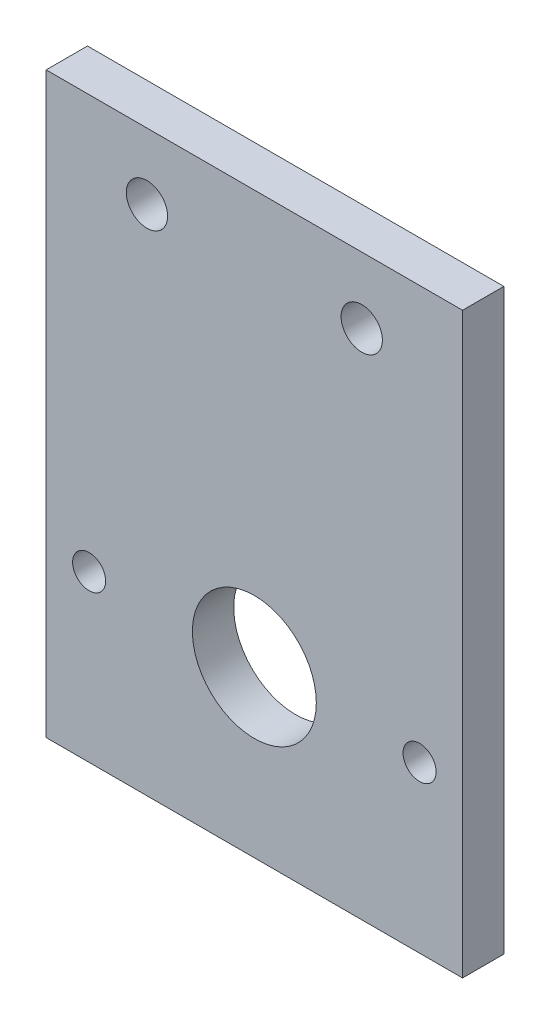
ISO-10303-21;
HEADER;
FILE_DESCRIPTION(('STEP AP214'),'2;1');
FILE_NAME('part.step','',(''),(''),'','','');
FILE_SCHEMA(('AUTOMOTIVE_DESIGN { 1 0 10303 214 1 1 1 1 }'));
ENDSEC;
DATA;
#1=APPLICATION_CONTEXT('core data for automotive mechanical design processes');
#2=APPLICATION_PROTOCOL_DEFINITION('international standard','automotive_design',2000,#1);
#3=PRODUCT_CONTEXT('',#1,'mechanical');
#4=PRODUCT('Part','Part','',(#3));
#5=PRODUCT_RELATED_PRODUCT_CATEGORY('part','',(#4));
#6=PRODUCT_DEFINITION_FORMATION('','',#4);
#7=PRODUCT_DEFINITION_CONTEXT('part definition',#1,'design');
#8=PRODUCT_DEFINITION('design','',#6,#7);
#9=PRODUCT_DEFINITION_SHAPE('','',#8);
#10=(LENGTH_UNIT() NAMED_UNIT(*) SI_UNIT(.MILLI.,.METRE.));
#11=(NAMED_UNIT(*) PLANE_ANGLE_UNIT() SI_UNIT($,.RADIAN.));
#12=(NAMED_UNIT(*) SI_UNIT($,.STERADIAN.) SOLID_ANGLE_UNIT());
#13=UNCERTAINTY_MEASURE_WITH_UNIT(LENGTH_MEASURE(1.E-05),#10,'distance_accuracy_value','');
#14=(GEOMETRIC_REPRESENTATION_CONTEXT(3) GLOBAL_UNCERTAINTY_ASSIGNED_CONTEXT((#13)) GLOBAL_UNIT_ASSIGNED_CONTEXT((#10,
#11,#12)) REPRESENTATION_CONTEXT('',''));
#15=CARTESIAN_POINT('',(0.,0.,0.));
#16=DIRECTION('',(0.,0.,1.));
#17=DIRECTION('',(1.,0.,0.));
#18=AXIS2_PLACEMENT_3D('',#15,#16,#17);
#19=CARTESIAN_POINT('',(32.004,-44.45,6.35));
#20=DIRECTION('',(-1.,0.,0.));
#21=DIRECTION('',(0.,0.,1.));
#22=AXIS2_PLACEMENT_3D('',#19,#20,#21);
#23=PLANE('',#22);
#24=DIRECTION('',(0.,1.,0.));
#25=VECTOR('',#24,1.);
#26=CARTESIAN_POINT('',(32.004,-44.45,0.));
#27=LINE('',#26,#25);
#28=CARTESIAN_POINT('',(32.004,-44.45,0.));
#29=VERTEX_POINT('',#28);
#30=CARTESIAN_POINT('',(32.004,44.45,0.));
#31=VERTEX_POINT('',#30);
#32=EDGE_CURVE('E97',#29,#31,#27,.T.);
#33=ORIENTED_EDGE('',*,*,#32,.T.);
#34=DIRECTION('',(0.,0.,-1.));
#35=VECTOR('',#34,1.);
#36=CARTESIAN_POINT('',(32.004,44.45,6.35));
#37=LINE('',#36,#35);
#38=CARTESIAN_POINT('',(32.004,44.45,6.35));
#39=VERTEX_POINT('',#38);
#40=EDGE_CURVE('E11',#39,#31,#37,.T.);
#41=ORIENTED_EDGE('',*,*,#40,.F.);
#42=DIRECTION('',(0.,1.,0.));
#43=VECTOR('',#42,1.);
#44=CARTESIAN_POINT('',(32.004,-44.45,6.35));
#45=LINE('',#44,#43);
#46=CARTESIAN_POINT('',(32.004,-44.45,6.35));
#47=VERTEX_POINT('',#46);
#48=EDGE_CURVE('E85',#47,#39,#45,.T.);
#49=ORIENTED_EDGE('',*,*,#48,.F.);
#50=DIRECTION('',(0.,0.,-1.));
#51=VECTOR('',#50,1.);
#52=CARTESIAN_POINT('',(32.004,-44.45,6.35));
#53=LINE('',#52,#51);
#54=EDGE_CURVE('E93',#47,#29,#53,.T.);
#55=ORIENTED_EDGE('',*,*,#54,.T.);
#56=EDGE_LOOP('',(#33,#41,#49,#55));
#57=FACE_BOUND('',#56,.T.);
#58=ADVANCED_FACE('F34',(#57),#23,.F.);
#59=CARTESIAN_POINT('',(-32.004,44.45,6.35));
#60=DIRECTION('',(0.,-1.,0.));
#61=DIRECTION('',(0.,0.,-1.));
#62=AXIS2_PLACEMENT_3D('',#59,#60,#61);
#63=PLANE('',#62);
#64=DIRECTION('',(-1.,0.,0.));
#65=VECTOR('',#64,1.);
#66=CARTESIAN_POINT('',(-32.004,44.45,0.));
#67=LINE('',#66,#65);
#68=CARTESIAN_POINT('',(-32.004,44.45,0.));
#69=VERTEX_POINT('',#68);
#70=EDGE_CURVE('E89',#31,#69,#67,.T.);
#71=ORIENTED_EDGE('',*,*,#70,.T.);
#72=DIRECTION('',(0.,0.,-1.));
#73=VECTOR('',#72,1.);
#74=CARTESIAN_POINT('',(-32.004,44.45,6.35));
#75=LINE('',#74,#73);
#76=CARTESIAN_POINT('',(-32.004,44.45,6.35));
#77=VERTEX_POINT('',#76);
#78=EDGE_CURVE('E42',#77,#69,#75,.T.);
#79=ORIENTED_EDGE('',*,*,#78,.F.);
#80=DIRECTION('',(-1.,0.,0.));
#81=VECTOR('',#80,1.);
#82=CARTESIAN_POINT('',(-32.004,44.45,6.35));
#83=LINE('',#82,#81);
#84=EDGE_CURVE('E80',#39,#77,#83,.T.);
#85=ORIENTED_EDGE('',*,*,#84,.F.);
#86=ORIENTED_EDGE('',*,*,#40,.T.);
#87=EDGE_LOOP('',(#71,#79,#85,#86));
#88=FACE_BOUND('',#87,.T.);
#89=ADVANCED_FACE('F88',(#88),#63,.F.);
#90=CARTESIAN_POINT('',(-32.004,-44.45,6.35));
#91=DIRECTION('',(1.,0.,0.));
#92=DIRECTION('',(0.,0.,-1.));
#93=AXIS2_PLACEMENT_3D('',#90,#91,#92);
#94=PLANE('',#93);
#95=DIRECTION('',(0.,-1.,0.));
#96=VECTOR('',#95,1.);
#97=CARTESIAN_POINT('',(-32.004,-44.45,0.));
#98=LINE('',#97,#96);
#99=CARTESIAN_POINT('',(-32.004,-44.45,0.));
#100=VERTEX_POINT('',#99);
#101=EDGE_CURVE('E67',#69,#100,#98,.T.);
#102=ORIENTED_EDGE('',*,*,#101,.T.);
#103=DIRECTION('',(0.,0.,-1.));
#104=VECTOR('',#103,1.);
#105=CARTESIAN_POINT('',(-32.004,-44.45,6.35));
#106=LINE('',#105,#104);
#107=CARTESIAN_POINT('',(-32.004,-44.45,6.35));
#108=VERTEX_POINT('',#107);
#109=EDGE_CURVE('E90',#108,#100,#106,.T.);
#110=ORIENTED_EDGE('',*,*,#109,.F.);
#111=DIRECTION('',(0.,-1.,0.));
#112=VECTOR('',#111,1.);
#113=CARTESIAN_POINT('',(-32.004,-44.45,6.35));
#114=LINE('',#113,#112);
#115=EDGE_CURVE('E83',#77,#108,#114,.T.);
#116=ORIENTED_EDGE('',*,*,#115,.F.);
#117=ORIENTED_EDGE('',*,*,#78,.T.);
#118=EDGE_LOOP('',(#102,#110,#116,#117));
#119=FACE_BOUND('',#118,.T.);
#120=ADVANCED_FACE('F91',(#119),#94,.F.);
#121=CARTESIAN_POINT('',(-32.004,-44.45,6.35));
#122=DIRECTION('',(0.,1.,0.));
#123=DIRECTION('',(0.,0.,1.));
#124=AXIS2_PLACEMENT_3D('',#121,#122,#123);
#125=PLANE('',#124);
#126=DIRECTION('',(1.,0.,0.));
#127=VECTOR('',#126,1.);
#128=CARTESIAN_POINT('',(-32.004,-44.45,0.));
#129=LINE('',#128,#127);
#130=EDGE_CURVE('E73',#100,#29,#129,.T.);
#131=ORIENTED_EDGE('',*,*,#130,.T.);
#132=ORIENTED_EDGE('',*,*,#54,.F.);
#133=DIRECTION('',(1.,0.,0.));
#134=VECTOR('',#133,1.);
#135=CARTESIAN_POINT('',(-32.004,-44.45,6.35));
#136=LINE('',#135,#134);
#137=EDGE_CURVE('E50',#108,#47,#136,.T.);
#138=ORIENTED_EDGE('',*,*,#137,.F.);
#139=ORIENTED_EDGE('',*,*,#109,.T.);
#140=EDGE_LOOP('',(#131,#132,#138,#139));
#141=FACE_BOUND('',#140,.T.);
#142=ADVANCED_FACE('F105',(#141),#125,.F.);
#143=CARTESIAN_POINT('',(32.004,44.45,6.35));
#144=DIRECTION('',(0.,0.,-1.));
#145=DIRECTION('',(-1.,0.,0.));
#146=AXIS2_PLACEMENT_3D('',#143,#144,#145);
#147=PLANE('',#146);
#148=CARTESIAN_POINT('',(16.51,34.29,6.35));
#149=DIRECTION('',(0.,0.,1.));
#150=DIRECTION('',(-1.,0.,0.));
#151=AXIS2_PLACEMENT_3D('',#148,#149,#150);
#152=CIRCLE('',#151,3.175);
#153=CARTESIAN_POINT('',(13.335,34.29,6.35));
#154=VERTEX_POINT('',#153);
#155=EDGE_CURVE('E135',#154,#154,#152,.T.);
#156=ORIENTED_EDGE('',*,*,#155,.F.);
#157=EDGE_LOOP('',(#156));
#158=FACE_BOUND('',#157,.T.);
#159=CARTESIAN_POINT('',(-16.51,34.29,6.35));
#160=DIRECTION('',(0.,0.,1.));
#161=DIRECTION('',(1.,0.,0.));
#162=AXIS2_PLACEMENT_3D('',#159,#160,#161);
#163=CIRCLE('',#162,3.175);
#164=CARTESIAN_POINT('',(-13.335,34.29,6.35));
#165=VERTEX_POINT('',#164);
#166=EDGE_CURVE('E129',#165,#165,#163,.T.);
#167=ORIENTED_EDGE('',*,*,#166,.F.);
#168=EDGE_LOOP('',(#167));
#169=FACE_BOUND('',#168,.T.);
#170=CARTESIAN_POINT('',(0.,-19.05,6.35));
#171=DIRECTION('',(0.,0.,1.));
#172=DIRECTION('',(1.,0.,0.));
#173=AXIS2_PLACEMENT_3D('',#170,#171,#172);
#174=CIRCLE('',#173,9.525);
#175=CARTESIAN_POINT('',(9.525,-19.05,6.35));
#176=VERTEX_POINT('',#175);
#177=EDGE_CURVE('E123',#176,#176,#174,.T.);
#178=ORIENTED_EDGE('',*,*,#177,.F.);
#179=EDGE_LOOP('',(#178));
#180=FACE_BOUND('',#179,.T.);
#181=CARTESIAN_POINT('',(25.4,-19.05,6.35));
#182=DIRECTION('',(0.,0.,1.));
#183=DIRECTION('',(-1.,0.,0.));
#184=AXIS2_PLACEMENT_3D('',#181,#182,#183);
#185=CIRCLE('',#184,2.54);
#186=CARTESIAN_POINT('',(22.86,-19.05,6.35));
#187=VERTEX_POINT('',#186);
#188=EDGE_CURVE('E117',#187,#187,#185,.T.);
#189=ORIENTED_EDGE('',*,*,#188,.F.);
#190=EDGE_LOOP('',(#189));
#191=FACE_BOUND('',#190,.T.);
#192=CARTESIAN_POINT('',(-25.4,-19.05,6.35));
#193=DIRECTION('',(0.,0.,1.));
#194=DIRECTION('',(1.,0.,0.));
#195=AXIS2_PLACEMENT_3D('',#192,#193,#194);
#196=CIRCLE('',#195,2.54);
#197=CARTESIAN_POINT('',(-22.86,-19.05,6.35));
#198=VERTEX_POINT('',#197);
#199=EDGE_CURVE('E111',#198,#198,#196,.T.);
#200=ORIENTED_EDGE('',*,*,#199,.F.);
#201=EDGE_LOOP('',(#200));
#202=FACE_BOUND('',#201,.T.);
#203=ORIENTED_EDGE('',*,*,#48,.T.);
#204=ORIENTED_EDGE('',*,*,#84,.T.);
#205=ORIENTED_EDGE('',*,*,#115,.T.);
#206=ORIENTED_EDGE('',*,*,#137,.T.);
#207=EDGE_LOOP('',(#203,#204,#205,#206));
#208=FACE_BOUND('',#207,.T.);
#209=ADVANCED_FACE('F81',(#158,#169,#180,#191,#202,#208),#147,.F.);
#210=CARTESIAN_POINT('',(32.004,44.45,0.));
#211=DIRECTION('',(0.,0.,-1.));
#212=DIRECTION('',(-1.,0.,0.));
#213=AXIS2_PLACEMENT_3D('',#210,#211,#212);
#214=PLANE('',#213);
#215=CARTESIAN_POINT('',(16.51,34.29,0.));
#216=DIRECTION('',(0.,0.,1.));
#217=DIRECTION('',(-1.,0.,0.));
#218=AXIS2_PLACEMENT_3D('',#215,#216,#217);
#219=CIRCLE('',#218,3.175);
#220=CARTESIAN_POINT('',(13.335,34.29,0.));
#221=VERTEX_POINT('',#220);
#222=EDGE_CURVE('E132',#221,#221,#219,.T.);
#223=ORIENTED_EDGE('',*,*,#222,.T.);
#224=EDGE_LOOP('',(#223));
#225=FACE_BOUND('',#224,.T.);
#226=CARTESIAN_POINT('',(-16.51,34.29,0.));
#227=DIRECTION('',(0.,0.,1.));
#228=DIRECTION('',(1.,0.,0.));
#229=AXIS2_PLACEMENT_3D('',#226,#227,#228);
#230=CIRCLE('',#229,3.175);
#231=CARTESIAN_POINT('',(-13.335,34.29,0.));
#232=VERTEX_POINT('',#231);
#233=EDGE_CURVE('E126',#232,#232,#230,.T.);
#234=ORIENTED_EDGE('',*,*,#233,.T.);
#235=EDGE_LOOP('',(#234));
#236=FACE_BOUND('',#235,.T.);
#237=CARTESIAN_POINT('',(0.,-19.05,0.));
#238=DIRECTION('',(0.,0.,1.));
#239=DIRECTION('',(1.,0.,0.));
#240=AXIS2_PLACEMENT_3D('',#237,#238,#239);
#241=CIRCLE('',#240,9.525);
#242=CARTESIAN_POINT('',(9.525,-19.05,0.));
#243=VERTEX_POINT('',#242);
#244=EDGE_CURVE('E120',#243,#243,#241,.T.);
#245=ORIENTED_EDGE('',*,*,#244,.T.);
#246=EDGE_LOOP('',(#245));
#247=FACE_BOUND('',#246,.T.);
#248=CARTESIAN_POINT('',(25.4,-19.05,0.));
#249=DIRECTION('',(0.,0.,1.));
#250=DIRECTION('',(-1.,0.,0.));
#251=AXIS2_PLACEMENT_3D('',#248,#249,#250);
#252=CIRCLE('',#251,2.54);
#253=CARTESIAN_POINT('',(22.86,-19.05,0.));
#254=VERTEX_POINT('',#253);
#255=EDGE_CURVE('E114',#254,#254,#252,.T.);
#256=ORIENTED_EDGE('',*,*,#255,.T.);
#257=EDGE_LOOP('',(#256));
#258=FACE_BOUND('',#257,.T.);
#259=CARTESIAN_POINT('',(-25.4,-19.05,0.));
#260=DIRECTION('',(0.,0.,1.));
#261=DIRECTION('',(1.,0.,0.));
#262=AXIS2_PLACEMENT_3D('',#259,#260,#261);
#263=CIRCLE('',#262,2.54);
#264=CARTESIAN_POINT('',(-22.86,-19.05,0.));
#265=VERTEX_POINT('',#264);
#266=EDGE_CURVE('E100',#265,#265,#263,.T.);
#267=ORIENTED_EDGE('',*,*,#266,.T.);
#268=EDGE_LOOP('',(#267));
#269=FACE_BOUND('',#268,.T.);
#270=ORIENTED_EDGE('',*,*,#32,.F.);
#271=ORIENTED_EDGE('',*,*,#130,.F.);
#272=ORIENTED_EDGE('',*,*,#101,.F.);
#273=ORIENTED_EDGE('',*,*,#70,.F.);
#274=EDGE_LOOP('',(#270,#271,#272,#273));
#275=FACE_BOUND('',#274,.T.);
#276=ADVANCED_FACE('F108',(#225,#236,#247,#258,#269,#275),#214,.T.);
#277=CARTESIAN_POINT('',(-25.4,-19.05,0.));
#278=DIRECTION('',(0.,0.,1.));
#279=DIRECTION('',(1.,0.,0.));
#280=AXIS2_PLACEMENT_3D('',#277,#278,#279);
#281=CYLINDRICAL_SURFACE('',#280,2.54);
#282=ORIENTED_EDGE('',*,*,#266,.F.);
#283=EDGE_LOOP('',(#282));
#284=FACE_BOUND('',#283,.T.);
#285=ORIENTED_EDGE('',*,*,#199,.T.);
#286=EDGE_LOOP('',(#285));
#287=FACE_BOUND('',#286,.T.);
#288=ADVANCED_FACE('F161',(#284,#287),#281,.F.);
#289=CARTESIAN_POINT('',(25.4,-19.05,0.));
#290=DIRECTION('',(0.,0.,1.));
#291=DIRECTION('',(1.,0.,0.));
#292=AXIS2_PLACEMENT_3D('',#289,#290,#291);
#293=CYLINDRICAL_SURFACE('',#292,2.54);
#294=ORIENTED_EDGE('',*,*,#255,.F.);
#295=EDGE_LOOP('',(#294));
#296=FACE_BOUND('',#295,.T.);
#297=ORIENTED_EDGE('',*,*,#188,.T.);
#298=EDGE_LOOP('',(#297));
#299=FACE_BOUND('',#298,.T.);
#300=ADVANCED_FACE('F163',(#296,#299),#293,.F.);
#301=CARTESIAN_POINT('',(0.,-19.05,0.));
#302=DIRECTION('',(0.,0.,1.));
#303=DIRECTION('',(1.,0.,0.));
#304=AXIS2_PLACEMENT_3D('',#301,#302,#303);
#305=CYLINDRICAL_SURFACE('',#304,9.525);
#306=ORIENTED_EDGE('',*,*,#244,.F.);
#307=EDGE_LOOP('',(#306));
#308=FACE_BOUND('',#307,.T.);
#309=ORIENTED_EDGE('',*,*,#177,.T.);
#310=EDGE_LOOP('',(#309));
#311=FACE_BOUND('',#310,.T.);
#312=ADVANCED_FACE('F170',(#308,#311),#305,.F.);
#313=CARTESIAN_POINT('',(-16.51,34.29,0.));
#314=DIRECTION('',(0.,0.,1.));
#315=DIRECTION('',(1.,0.,0.));
#316=AXIS2_PLACEMENT_3D('',#313,#314,#315);
#317=CYLINDRICAL_SURFACE('',#316,3.175);
#318=ORIENTED_EDGE('',*,*,#233,.F.);
#319=EDGE_LOOP('',(#318));
#320=FACE_BOUND('',#319,.T.);
#321=ORIENTED_EDGE('',*,*,#166,.T.);
#322=EDGE_LOOP('',(#321));
#323=FACE_BOUND('',#322,.T.);
#324=ADVANCED_FACE('F146',(#320,#323),#317,.F.);
#325=CARTESIAN_POINT('',(16.51,34.29,0.));
#326=DIRECTION('',(0.,0.,1.));
#327=DIRECTION('',(1.,0.,0.));
#328=AXIS2_PLACEMENT_3D('',#325,#326,#327);
#329=CYLINDRICAL_SURFACE('',#328,3.175);
#330=ORIENTED_EDGE('',*,*,#222,.F.);
#331=EDGE_LOOP('',(#330));
#332=FACE_BOUND('',#331,.T.);
#333=ORIENTED_EDGE('',*,*,#155,.T.);
#334=EDGE_LOOP('',(#333));
#335=FACE_BOUND('',#334,.T.);
#336=ADVANCED_FACE('F143',(#332,#335),#329,.F.);
#337=CLOSED_SHELL('',(#58,#89,#120,#142,#209,#276,#288,#300,#312,#324,#336));
#338=MANIFOLD_SOLID_BREP('B2',#337);
#339=ADVANCED_BREP_SHAPE_REPRESENTATION('',(#18,#338),#14);
#340=SHAPE_DEFINITION_REPRESENTATION(#9,#339);
ENDSEC;
END-ISO-10303-21;
